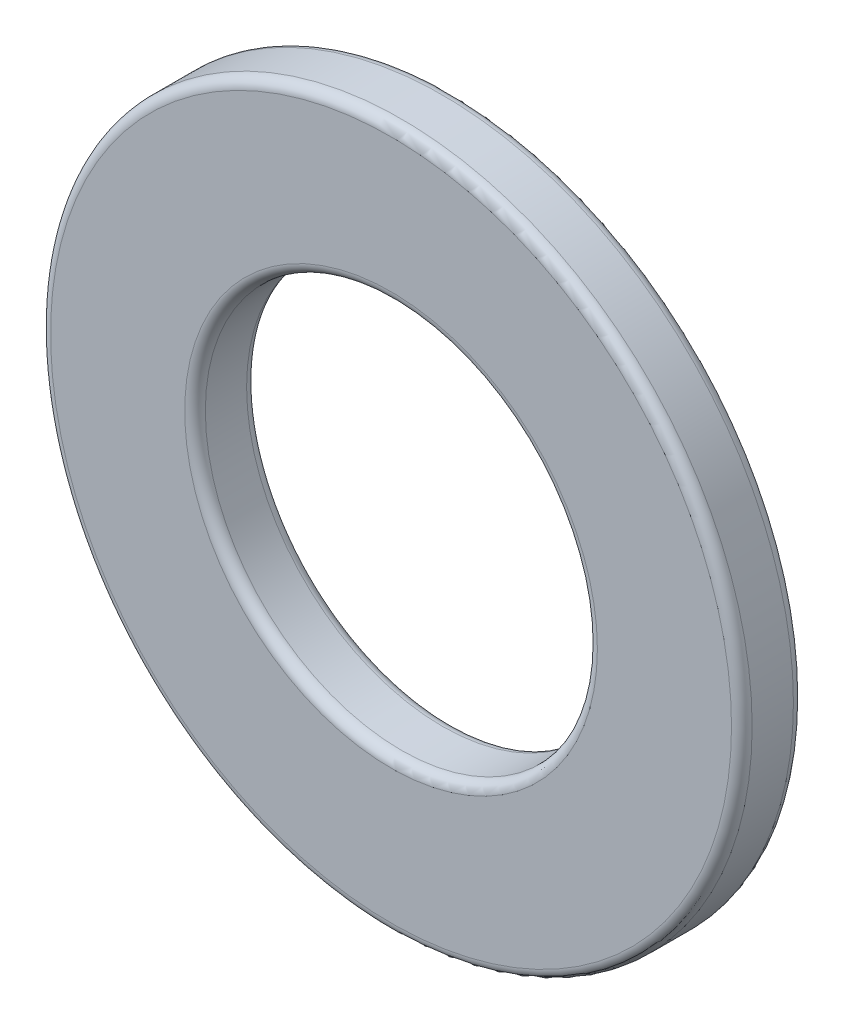
ISO-10303-21;
HEADER;
FILE_DESCRIPTION(('STEP AP214'),'2;1');
FILE_NAME('part.step','',(''),(''),'','','');
FILE_SCHEMA(('AUTOMOTIVE_DESIGN { 1 0 10303 214 1 1 1 1 }'));
ENDSEC;
DATA;
#1=APPLICATION_CONTEXT('core data for automotive mechanical design processes');
#2=APPLICATION_PROTOCOL_DEFINITION('international standard','automotive_design',2000,#1);
#3=PRODUCT_CONTEXT('',#1,'mechanical');
#4=PRODUCT('Part','Part','',(#3));
#5=PRODUCT_RELATED_PRODUCT_CATEGORY('part','',(#4));
#6=PRODUCT_DEFINITION_FORMATION('','',#4);
#7=PRODUCT_DEFINITION_CONTEXT('part definition',#1,'design');
#8=PRODUCT_DEFINITION('design','',#6,#7);
#9=PRODUCT_DEFINITION_SHAPE('','',#8);
#10=(LENGTH_UNIT() NAMED_UNIT(*) SI_UNIT(.MILLI.,.METRE.));
#11=(NAMED_UNIT(*) PLANE_ANGLE_UNIT() SI_UNIT($,.RADIAN.));
#12=(NAMED_UNIT(*) SI_UNIT($,.STERADIAN.) SOLID_ANGLE_UNIT());
#13=UNCERTAINTY_MEASURE_WITH_UNIT(LENGTH_MEASURE(1.E-05),#10,'distance_accuracy_value','');
#14=(GEOMETRIC_REPRESENTATION_CONTEXT(3) GLOBAL_UNCERTAINTY_ASSIGNED_CONTEXT((#13)) GLOBAL_UNIT_ASSIGNED_CONTEXT((#10,
#11,#12)) REPRESENTATION_CONTEXT('',''));
#15=CARTESIAN_POINT('',(0.,0.,0.));
#16=DIRECTION('',(0.,0.,1.));
#17=DIRECTION('',(1.,0.,0.));
#18=AXIS2_PLACEMENT_3D('',#15,#16,#17);
#19=CARTESIAN_POINT('',(0.,0.,3.));
#20=DIRECTION('',(0.,0.,1.));
#21=DIRECTION('',(1.,0.,0.));
#22=AXIS2_PLACEMENT_3D('',#19,#20,#21);
#23=PLANE('',#22);
#24=CARTESIAN_POINT('',(0.,0.,3.));
#25=DIRECTION('',(0.,0.,1.));
#26=DIRECTION('',(1.,0.,0.));
#27=AXIS2_PLACEMENT_3D('',#24,#25,#26);
#28=CIRCLE('',#27,16.5);
#29=CARTESIAN_POINT('',(16.5,0.,3.));
#30=VERTEX_POINT('',#29);
#31=EDGE_CURVE('E10',#30,#30,#28,.T.);
#32=ORIENTED_EDGE('',*,*,#31,.T.);
#33=EDGE_LOOP('',(#32));
#34=FACE_BOUND('',#33,.T.);
#35=CARTESIAN_POINT('',(0.,0.,3.));
#36=DIRECTION('',(0.,0.,1.));
#37=DIRECTION('',(1.,0.,0.));
#38=AXIS2_PLACEMENT_3D('',#35,#36,#37);
#39=CIRCLE('',#38,10.);
#40=CARTESIAN_POINT('',(10.,0.,3.));
#41=VERTEX_POINT('',#40);
#42=EDGE_CURVE('E38',#41,#41,#39,.F.);
#43=ORIENTED_EDGE('',*,*,#42,.T.);
#44=EDGE_LOOP('',(#43));
#45=FACE_BOUND('',#44,.T.);
#46=ADVANCED_FACE('F31',(#34,#45),#23,.T.);
#47=CARTESIAN_POINT('',(0.,0.,0.));
#48=DIRECTION('',(0.,0.,1.));
#49=DIRECTION('',(1.,0.,0.));
#50=AXIS2_PLACEMENT_3D('',#47,#48,#49);
#51=PLANE('',#50);
#52=CARTESIAN_POINT('',(0.,0.,0.));
#53=DIRECTION('',(0.,0.,1.));
#54=DIRECTION('',(1.,0.,0.));
#55=AXIS2_PLACEMENT_3D('',#52,#53,#54);
#56=CIRCLE('',#55,10.);
#57=CARTESIAN_POINT('',(10.,0.,0.));
#58=VERTEX_POINT('',#57);
#59=EDGE_CURVE('E57',#58,#58,#56,.T.);
#60=ORIENTED_EDGE('',*,*,#59,.T.);
#61=EDGE_LOOP('',(#60));
#62=FACE_BOUND('',#61,.T.);
#63=CARTESIAN_POINT('',(0.,0.,0.));
#64=DIRECTION('',(0.,0.,1.));
#65=DIRECTION('',(1.,0.,0.));
#66=AXIS2_PLACEMENT_3D('',#63,#64,#65);
#67=CIRCLE('',#66,16.5);
#68=CARTESIAN_POINT('',(16.5,0.,0.));
#69=VERTEX_POINT('',#68);
#70=EDGE_CURVE('E60',#69,#69,#67,.F.);
#71=ORIENTED_EDGE('',*,*,#70,.T.);
#72=EDGE_LOOP('',(#71));
#73=FACE_BOUND('',#72,.T.);
#74=ADVANCED_FACE('F64',(#62,#73),#51,.F.);
#75=CARTESIAN_POINT('',(0.,0.,3.));
#76=DIRECTION('',(0.,0.,-1.));
#77=DIRECTION('',(-1.,0.,0.));
#78=AXIS2_PLACEMENT_3D('',#75,#76,#77);
#79=CYLINDRICAL_SURFACE('',#78,17.);
#80=CARTESIAN_POINT('',(0.,0.,0.5));
#81=DIRECTION('',(0.,0.,1.));
#82=DIRECTION('',(1.,0.,0.));
#83=AXIS2_PLACEMENT_3D('',#80,#81,#82);
#84=CIRCLE('',#83,17.);
#85=CARTESIAN_POINT('',(17.,0.,0.5));
#86=VERTEX_POINT('',#85);
#87=EDGE_CURVE('E42',#86,#86,#84,.T.);
#88=ORIENTED_EDGE('',*,*,#87,.T.);
#89=EDGE_LOOP('',(#88));
#90=FACE_BOUND('',#89,.T.);
#91=CARTESIAN_POINT('',(0.,0.,2.5));
#92=DIRECTION('',(0.,0.,1.));
#93=DIRECTION('',(1.,0.,0.));
#94=AXIS2_PLACEMENT_3D('',#91,#92,#93);
#95=CIRCLE('',#94,17.);
#96=CARTESIAN_POINT('',(17.,0.,2.5));
#97=VERTEX_POINT('',#96);
#98=EDGE_CURVE('E46',#97,#97,#95,.F.);
#99=ORIENTED_EDGE('',*,*,#98,.T.);
#100=EDGE_LOOP('',(#99));
#101=FACE_BOUND('',#100,.T.);
#102=ADVANCED_FACE('F74',(#90,#101),#79,.T.);
#103=CARTESIAN_POINT('',(0.,0.,3.));
#104=DIRECTION('',(0.,0.,-1.));
#105=DIRECTION('',(-1.,0.,0.));
#106=AXIS2_PLACEMENT_3D('',#103,#104,#105);
#107=CYLINDRICAL_SURFACE('',#106,9.5);
#108=CARTESIAN_POINT('',(0.,0.,0.5));
#109=DIRECTION('',(0.,0.,1.));
#110=DIRECTION('',(1.,0.,0.));
#111=AXIS2_PLACEMENT_3D('',#108,#109,#110);
#112=CIRCLE('',#111,9.5);
#113=CARTESIAN_POINT('',(9.5,0.,0.5));
#114=VERTEX_POINT('',#113);
#115=EDGE_CURVE('E51',#114,#114,#112,.F.);
#116=ORIENTED_EDGE('',*,*,#115,.T.);
#117=EDGE_LOOP('',(#116));
#118=FACE_BOUND('',#117,.T.);
#119=CARTESIAN_POINT('',(0.,0.,2.5));
#120=DIRECTION('',(0.,0.,1.));
#121=DIRECTION('',(1.,0.,0.));
#122=AXIS2_PLACEMENT_3D('',#119,#120,#121);
#123=CIRCLE('',#122,9.5);
#124=CARTESIAN_POINT('',(9.5,0.,2.5));
#125=VERTEX_POINT('',#124);
#126=EDGE_CURVE('E54',#125,#125,#123,.T.);
#127=ORIENTED_EDGE('',*,*,#126,.T.);
#128=EDGE_LOOP('',(#127));
#129=FACE_BOUND('',#128,.T.);
#130=ADVANCED_FACE('F77',(#118,#129),#107,.F.);
#131=CARTESIAN_POINT('',(0.,0.,0.5));
#132=DIRECTION('',(0.,0.,1.));
#133=DIRECTION('',(1.,0.,0.));
#134=AXIS2_PLACEMENT_3D('',#131,#132,#133);
#135=TOROIDAL_SURFACE('',#134,10.,0.5);
#136=ORIENTED_EDGE('',*,*,#115,.F.);
#137=EDGE_LOOP('',(#136));
#138=FACE_BOUND('',#137,.T.);
#139=ORIENTED_EDGE('',*,*,#59,.F.);
#140=EDGE_LOOP('',(#139));
#141=FACE_BOUND('',#140,.T.);
#142=ADVANCED_FACE('F70',(#138,#141),#135,.T.);
#143=CARTESIAN_POINT('',(0.,0.,0.5));
#144=DIRECTION('',(0.,0.,1.));
#145=DIRECTION('',(1.,0.,0.));
#146=AXIS2_PLACEMENT_3D('',#143,#144,#145);
#147=TOROIDAL_SURFACE('',#146,16.5,0.5);
#148=ORIENTED_EDGE('',*,*,#70,.F.);
#149=EDGE_LOOP('',(#148));
#150=FACE_BOUND('',#149,.T.);
#151=ORIENTED_EDGE('',*,*,#87,.F.);
#152=EDGE_LOOP('',(#151));
#153=FACE_BOUND('',#152,.T.);
#154=ADVANCED_FACE('F66',(#150,#153),#147,.T.);
#155=CARTESIAN_POINT('',(0.,0.,2.5));
#156=DIRECTION('',(0.,0.,1.));
#157=DIRECTION('',(1.,0.,0.));
#158=AXIS2_PLACEMENT_3D('',#155,#156,#157);
#159=TOROIDAL_SURFACE('',#158,16.5,0.5);
#160=ORIENTED_EDGE('',*,*,#98,.F.);
#161=EDGE_LOOP('',(#160));
#162=FACE_BOUND('',#161,.T.);
#163=ORIENTED_EDGE('',*,*,#31,.F.);
#164=EDGE_LOOP('',(#163));
#165=FACE_BOUND('',#164,.T.);
#166=ADVANCED_FACE('F69',(#162,#165),#159,.T.);
#167=CARTESIAN_POINT('',(0.,0.,2.5));
#168=DIRECTION('',(0.,0.,1.));
#169=DIRECTION('',(1.,0.,0.));
#170=AXIS2_PLACEMENT_3D('',#167,#168,#169);
#171=TOROIDAL_SURFACE('',#170,10.,0.5);
#172=ORIENTED_EDGE('',*,*,#42,.F.);
#173=EDGE_LOOP('',(#172));
#174=FACE_BOUND('',#173,.T.);
#175=ORIENTED_EDGE('',*,*,#126,.F.);
#176=EDGE_LOOP('',(#175));
#177=FACE_BOUND('',#176,.T.);
#178=ADVANCED_FACE('F33',(#174,#177),#171,.T.);
#179=CLOSED_SHELL('',(#46,#74,#102,#130,#142,#154,#166,#178));
#180=MANIFOLD_SOLID_BREP('B2',#179);
#181=ADVANCED_BREP_SHAPE_REPRESENTATION('',(#18,#180),#14);
#182=SHAPE_DEFINITION_REPRESENTATION(#9,#181);
ENDSEC;
END-ISO-10303-21;
